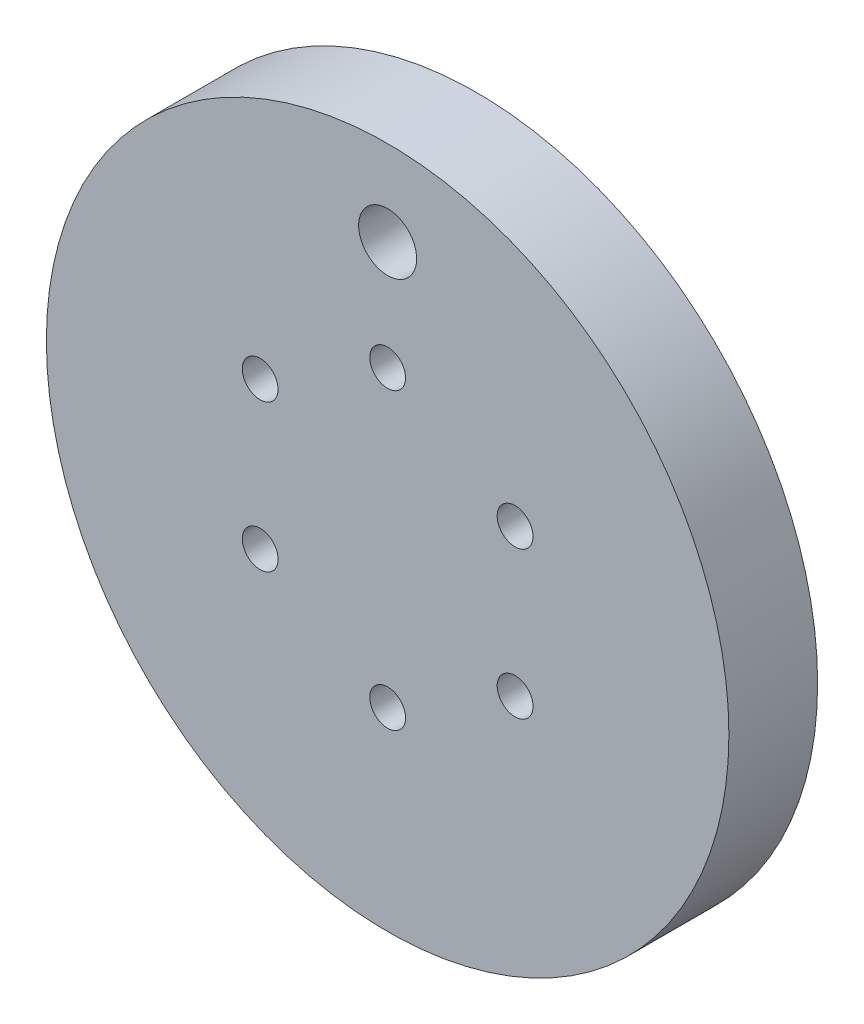
ISO-10303-21;
HEADER;
FILE_DESCRIPTION(('STEP AP214'),'2;1');
FILE_NAME('part.step','',(''),(''),'','','');
FILE_SCHEMA(('AUTOMOTIVE_DESIGN { 1 0 10303 214 1 1 1 1 }'));
ENDSEC;
DATA;
#1=APPLICATION_CONTEXT('core data for automotive mechanical design processes');
#2=APPLICATION_PROTOCOL_DEFINITION('international standard','automotive_design',2000,#1);
#3=PRODUCT_CONTEXT('',#1,'mechanical');
#4=PRODUCT('Part','Part','',(#3));
#5=PRODUCT_RELATED_PRODUCT_CATEGORY('part','',(#4));
#6=PRODUCT_DEFINITION_FORMATION('','',#4);
#7=PRODUCT_DEFINITION_CONTEXT('part definition',#1,'design');
#8=PRODUCT_DEFINITION('design','',#6,#7);
#9=PRODUCT_DEFINITION_SHAPE('','',#8);
#10=(LENGTH_UNIT() NAMED_UNIT(*) SI_UNIT(.MILLI.,.METRE.));
#11=(NAMED_UNIT(*) PLANE_ANGLE_UNIT() SI_UNIT($,.RADIAN.));
#12=(NAMED_UNIT(*) SI_UNIT($,.STERADIAN.) SOLID_ANGLE_UNIT());
#13=UNCERTAINTY_MEASURE_WITH_UNIT(LENGTH_MEASURE(1.E-05),#10,'distance_accuracy_value','');
#14=(GEOMETRIC_REPRESENTATION_CONTEXT(3) GLOBAL_UNCERTAINTY_ASSIGNED_CONTEXT((#13)) GLOBAL_UNIT_ASSIGNED_CONTEXT((#10,
#11,#12)) REPRESENTATION_CONTEXT('',''));
#15=CARTESIAN_POINT('',(0.,0.,0.));
#16=DIRECTION('',(0.,0.,1.));
#17=DIRECTION('',(1.,0.,0.));
#18=AXIS2_PLACEMENT_3D('',#15,#16,#17);
#19=CARTESIAN_POINT('',(0.,0.,10.4));
#20=DIRECTION('',(0.,0.,1.));
#21=DIRECTION('',(1.,0.,0.));
#22=AXIS2_PLACEMENT_3D('',#19,#20,#21);
#23=PLANE('',#22);
#24=CARTESIAN_POINT('',(0.,30.,10.4));
#25=DIRECTION('',(0.,0.,1.));
#26=DIRECTION('',(1.,0.,0.));
#27=AXIS2_PLACEMENT_3D('',#24,#25,#26);
#28=CIRCLE('',#27,3.4);
#29=CARTESIAN_POINT('',(3.4,30.,10.4));
#30=VERTEX_POINT('',#29);
#31=EDGE_CURVE('E145',#30,#30,#28,.T.);
#32=ORIENTED_EDGE('',*,*,#31,.F.);
#33=EDGE_LOOP('',(#32));
#34=FACE_BOUND('',#33,.T.);
#35=CARTESIAN_POINT('',(14.9389382152816,8.62500000000001,10.4));
#36=DIRECTION('',(0.,0.,1.));
#37=DIRECTION('',(1.,0.,0.));
#38=AXIS2_PLACEMENT_3D('',#35,#36,#37);
#39=CIRCLE('',#38,2.1);
#40=CARTESIAN_POINT('',(17.0389382152816,8.62500000000001,10.4));
#41=VERTEX_POINT('',#40);
#42=EDGE_CURVE('E127',#41,#41,#39,.T.);
#43=ORIENTED_EDGE('',*,*,#42,.F.);
#44=EDGE_LOOP('',(#43));
#45=FACE_BOUND('',#44,.T.);
#46=CARTESIAN_POINT('',(0.,-17.25,10.4));
#47=DIRECTION('',(0.,0.,1.));
#48=DIRECTION('',(1.,0.,0.));
#49=AXIS2_PLACEMENT_3D('',#46,#47,#48);
#50=CIRCLE('',#49,2.1);
#51=CARTESIAN_POINT('',(2.1,-17.25,10.4));
#52=VERTEX_POINT('',#51);
#53=EDGE_CURVE('E111',#52,#52,#50,.T.);
#54=ORIENTED_EDGE('',*,*,#53,.F.);
#55=EDGE_LOOP('',(#54));
#56=FACE_BOUND('',#55,.T.);
#57=CARTESIAN_POINT('',(-14.9389382152816,8.62499999999999,10.4));
#58=DIRECTION('',(0.,0.,1.));
#59=DIRECTION('',(1.,0.,0.));
#60=AXIS2_PLACEMENT_3D('',#57,#58,#59);
#61=CIRCLE('',#60,2.1);
#62=CARTESIAN_POINT('',(-12.8389382152816,8.62499999999999,10.4));
#63=VERTEX_POINT('',#62);
#64=EDGE_CURVE('E97',#63,#63,#61,.T.);
#65=ORIENTED_EDGE('',*,*,#64,.F.);
#66=EDGE_LOOP('',(#65));
#67=FACE_BOUND('',#66,.T.);
#68=CARTESIAN_POINT('',(0.,0.,10.4));
#69=DIRECTION('',(0.,0.,1.));
#70=DIRECTION('',(1.,0.,0.));
#71=AXIS2_PLACEMENT_3D('',#68,#69,#70);
#72=CIRCLE('',#71,40.);
#73=CARTESIAN_POINT('',(40.,0.,10.4));
#74=VERTEX_POINT('',#73);
#75=EDGE_CURVE('E11',#74,#74,#72,.T.);
#76=ORIENTED_EDGE('',*,*,#75,.T.);
#77=EDGE_LOOP('',(#76));
#78=FACE_BOUND('',#77,.T.);
#79=CARTESIAN_POINT('',(-14.9389382152816,-8.62500000000001,10.4));
#80=DIRECTION('',(0.,0.,1.));
#81=DIRECTION('',(1.,0.,0.));
#82=AXIS2_PLACEMENT_3D('',#79,#80,#81);
#83=CIRCLE('',#82,2.1);
#84=CARTESIAN_POINT('',(-12.8389382152816,-8.62500000000001,10.4));
#85=VERTEX_POINT('',#84);
#86=EDGE_CURVE('E103',#85,#85,#83,.T.);
#87=ORIENTED_EDGE('',*,*,#86,.F.);
#88=EDGE_LOOP('',(#87));
#89=FACE_BOUND('',#88,.T.);
#90=CARTESIAN_POINT('',(14.9389382152816,-8.625,10.4));
#91=DIRECTION('',(0.,0.,1.));
#92=DIRECTION('',(1.,0.,0.));
#93=AXIS2_PLACEMENT_3D('',#90,#91,#92);
#94=CIRCLE('',#93,2.1);
#95=CARTESIAN_POINT('',(17.0389382152816,-8.625,10.4));
#96=VERTEX_POINT('',#95);
#97=EDGE_CURVE('E119',#96,#96,#94,.T.);
#98=ORIENTED_EDGE('',*,*,#97,.F.);
#99=EDGE_LOOP('',(#98));
#100=FACE_BOUND('',#99,.T.);
#101=CARTESIAN_POINT('',(0.,17.25,10.4));
#102=DIRECTION('',(0.,0.,1.));
#103=DIRECTION('',(1.,0.,0.));
#104=AXIS2_PLACEMENT_3D('',#101,#102,#103);
#105=CIRCLE('',#104,2.1);
#106=CARTESIAN_POINT('',(2.1,17.25,10.4));
#107=VERTEX_POINT('',#106);
#108=EDGE_CURVE('E134',#107,#107,#105,.T.);
#109=ORIENTED_EDGE('',*,*,#108,.F.);
#110=EDGE_LOOP('',(#109));
#111=FACE_BOUND('',#110,.T.);
#112=ADVANCED_FACE('F81',(#34,#45,#56,#67,#78,#89,#100,#111),#23,.T.);
#113=CARTESIAN_POINT('',(0.,0.,0.));
#114=DIRECTION('',(0.,0.,1.));
#115=DIRECTION('',(1.,0.,0.));
#116=AXIS2_PLACEMENT_3D('',#113,#114,#115);
#117=PLANE('',#116);
#118=CARTESIAN_POINT('',(0.,30.,0.));
#119=DIRECTION('',(0.,0.,1.));
#120=DIRECTION('',(1.,0.,0.));
#121=AXIS2_PLACEMENT_3D('',#118,#119,#120);
#122=CIRCLE('',#121,3.4);
#123=CARTESIAN_POINT('',(3.4,30.,0.));
#124=VERTEX_POINT('',#123);
#125=EDGE_CURVE('E141',#124,#124,#122,.T.);
#126=ORIENTED_EDGE('',*,*,#125,.T.);
#127=EDGE_LOOP('',(#126));
#128=FACE_BOUND('',#127,.T.);
#129=CARTESIAN_POINT('',(0.,0.,0.));
#130=DIRECTION('',(0.,0.,1.));
#131=DIRECTION('',(1.,0.,0.));
#132=AXIS2_PLACEMENT_3D('',#129,#130,#131);
#133=CIRCLE('',#132,40.);
#134=CARTESIAN_POINT('',(40.,0.,0.));
#135=VERTEX_POINT('',#134);
#136=EDGE_CURVE('E85',#135,#135,#133,.T.);
#137=ORIENTED_EDGE('',*,*,#136,.F.);
#138=EDGE_LOOP('',(#137));
#139=FACE_BOUND('',#138,.T.);
#140=CARTESIAN_POINT('',(-14.9389382152816,8.62499999999999,0.));
#141=DIRECTION('',(0.,0.,1.));
#142=DIRECTION('',(1.,0.,0.));
#143=AXIS2_PLACEMENT_3D('',#140,#141,#142);
#144=CIRCLE('',#143,2.1);
#145=CARTESIAN_POINT('',(-12.8389382152816,8.62499999999999,0.));
#146=VERTEX_POINT('',#145);
#147=EDGE_CURVE('E99',#146,#146,#144,.T.);
#148=ORIENTED_EDGE('',*,*,#147,.T.);
#149=EDGE_LOOP('',(#148));
#150=FACE_BOUND('',#149,.T.);
#151=CARTESIAN_POINT('',(-14.9389382152816,-8.62500000000001,0.));
#152=DIRECTION('',(0.,0.,1.));
#153=DIRECTION('',(1.,0.,0.));
#154=AXIS2_PLACEMENT_3D('',#151,#152,#153);
#155=CIRCLE('',#154,2.1);
#156=CARTESIAN_POINT('',(-12.8389382152816,-8.62500000000001,0.));
#157=VERTEX_POINT('',#156);
#158=EDGE_CURVE('E107',#157,#157,#155,.T.);
#159=ORIENTED_EDGE('',*,*,#158,.T.);
#160=EDGE_LOOP('',(#159));
#161=FACE_BOUND('',#160,.T.);
#162=CARTESIAN_POINT('',(0.,-17.25,0.));
#163=DIRECTION('',(0.,0.,1.));
#164=DIRECTION('',(1.,0.,0.));
#165=AXIS2_PLACEMENT_3D('',#162,#163,#164);
#166=CIRCLE('',#165,2.1);
#167=CARTESIAN_POINT('',(2.1,-17.25,0.));
#168=VERTEX_POINT('',#167);
#169=EDGE_CURVE('E115',#168,#168,#166,.T.);
#170=ORIENTED_EDGE('',*,*,#169,.T.);
#171=EDGE_LOOP('',(#170));
#172=FACE_BOUND('',#171,.T.);
#173=CARTESIAN_POINT('',(14.9389382152816,-8.625,0.));
#174=DIRECTION('',(0.,0.,1.));
#175=DIRECTION('',(1.,0.,0.));
#176=AXIS2_PLACEMENT_3D('',#173,#174,#175);
#177=CIRCLE('',#176,2.1);
#178=CARTESIAN_POINT('',(17.0389382152816,-8.625,0.));
#179=VERTEX_POINT('',#178);
#180=EDGE_CURVE('E123',#179,#179,#177,.T.);
#181=ORIENTED_EDGE('',*,*,#180,.T.);
#182=EDGE_LOOP('',(#181));
#183=FACE_BOUND('',#182,.T.);
#184=CARTESIAN_POINT('',(14.9389382152816,8.62500000000001,0.));
#185=DIRECTION('',(0.,0.,1.));
#186=DIRECTION('',(1.,0.,0.));
#187=AXIS2_PLACEMENT_3D('',#184,#185,#186);
#188=CIRCLE('',#187,2.1);
#189=CARTESIAN_POINT('',(17.0389382152816,8.62500000000001,0.));
#190=VERTEX_POINT('',#189);
#191=EDGE_CURVE('E130',#190,#190,#188,.T.);
#192=ORIENTED_EDGE('',*,*,#191,.T.);
#193=EDGE_LOOP('',(#192));
#194=FACE_BOUND('',#193,.T.);
#195=CARTESIAN_POINT('',(0.,17.25,0.));
#196=DIRECTION('',(0.,0.,1.));
#197=DIRECTION('',(1.,0.,0.));
#198=AXIS2_PLACEMENT_3D('',#195,#196,#197);
#199=CIRCLE('',#198,2.1);
#200=CARTESIAN_POINT('',(2.1,17.25,0.));
#201=VERTEX_POINT('',#200);
#202=EDGE_CURVE('E138',#201,#201,#199,.T.);
#203=ORIENTED_EDGE('',*,*,#202,.T.);
#204=EDGE_LOOP('',(#203));
#205=FACE_BOUND('',#204,.T.);
#206=ADVANCED_FACE('F154',(#128,#139,#150,#161,#172,#183,#194,#205),#117,.F.);
#207=CARTESIAN_POINT('',(0.,0.,10.4));
#208=DIRECTION('',(0.,0.,-1.));
#209=DIRECTION('',(-1.,0.,0.));
#210=AXIS2_PLACEMENT_3D('',#207,#208,#209);
#211=CYLINDRICAL_SURFACE('',#210,40.);
#212=ORIENTED_EDGE('',*,*,#75,.F.);
#213=EDGE_LOOP('',(#212));
#214=FACE_BOUND('',#213,.T.);
#215=ORIENTED_EDGE('',*,*,#136,.T.);
#216=EDGE_LOOP('',(#215));
#217=FACE_BOUND('',#216,.T.);
#218=ADVANCED_FACE('F83',(#214,#217),#211,.T.);
#219=CARTESIAN_POINT('',(-14.9389382152816,8.62499999999999,10.4));
#220=DIRECTION('',(0.,0.,-1.));
#221=DIRECTION('',(-1.,0.,0.));
#222=AXIS2_PLACEMENT_3D('',#219,#220,#221);
#223=CYLINDRICAL_SURFACE('',#222,2.1);
#224=ORIENTED_EDGE('',*,*,#64,.T.);
#225=EDGE_LOOP('',(#224));
#226=FACE_BOUND('',#225,.T.);
#227=ORIENTED_EDGE('',*,*,#147,.F.);
#228=EDGE_LOOP('',(#227));
#229=FACE_BOUND('',#228,.T.);
#230=ADVANCED_FACE('F189',(#226,#229),#223,.F.);
#231=CARTESIAN_POINT('',(-14.9389382152816,-8.62500000000001,10.4));
#232=DIRECTION('',(0.,0.,-1.));
#233=DIRECTION('',(-1.,0.,0.));
#234=AXIS2_PLACEMENT_3D('',#231,#232,#233);
#235=CYLINDRICAL_SURFACE('',#234,2.1);
#236=ORIENTED_EDGE('',*,*,#86,.T.);
#237=EDGE_LOOP('',(#236));
#238=FACE_BOUND('',#237,.T.);
#239=ORIENTED_EDGE('',*,*,#158,.F.);
#240=EDGE_LOOP('',(#239));
#241=FACE_BOUND('',#240,.T.);
#242=ADVANCED_FACE('F194',(#238,#241),#235,.F.);
#243=CARTESIAN_POINT('',(0.,-17.25,10.4));
#244=DIRECTION('',(0.,0.,-1.));
#245=DIRECTION('',(-1.,0.,0.));
#246=AXIS2_PLACEMENT_3D('',#243,#244,#245);
#247=CYLINDRICAL_SURFACE('',#246,2.1);
#248=ORIENTED_EDGE('',*,*,#53,.T.);
#249=EDGE_LOOP('',(#248));
#250=FACE_BOUND('',#249,.T.);
#251=ORIENTED_EDGE('',*,*,#169,.F.);
#252=EDGE_LOOP('',(#251));
#253=FACE_BOUND('',#252,.T.);
#254=ADVANCED_FACE('F198',(#250,#253),#247,.F.);
#255=CARTESIAN_POINT('',(14.9389382152816,-8.625,10.4));
#256=DIRECTION('',(0.,0.,-1.));
#257=DIRECTION('',(-1.,0.,0.));
#258=AXIS2_PLACEMENT_3D('',#255,#256,#257);
#259=CYLINDRICAL_SURFACE('',#258,2.1);
#260=ORIENTED_EDGE('',*,*,#97,.T.);
#261=EDGE_LOOP('',(#260));
#262=FACE_BOUND('',#261,.T.);
#263=ORIENTED_EDGE('',*,*,#180,.F.);
#264=EDGE_LOOP('',(#263));
#265=FACE_BOUND('',#264,.T.);
#266=ADVANCED_FACE('F202',(#262,#265),#259,.F.);
#267=CARTESIAN_POINT('',(14.9389382152816,8.62500000000001,10.4));
#268=DIRECTION('',(0.,0.,-1.));
#269=DIRECTION('',(-1.,0.,0.));
#270=AXIS2_PLACEMENT_3D('',#267,#268,#269);
#271=CYLINDRICAL_SURFACE('',#270,2.1);
#272=ORIENTED_EDGE('',*,*,#42,.T.);
#273=EDGE_LOOP('',(#272));
#274=FACE_BOUND('',#273,.T.);
#275=ORIENTED_EDGE('',*,*,#191,.F.);
#276=EDGE_LOOP('',(#275));
#277=FACE_BOUND('',#276,.T.);
#278=ADVANCED_FACE('F181',(#274,#277),#271,.F.);
#279=CARTESIAN_POINT('',(0.,17.25,10.4));
#280=DIRECTION('',(0.,0.,-1.));
#281=DIRECTION('',(-1.,0.,0.));
#282=AXIS2_PLACEMENT_3D('',#279,#280,#281);
#283=CYLINDRICAL_SURFACE('',#282,2.1);
#284=ORIENTED_EDGE('',*,*,#108,.T.);
#285=EDGE_LOOP('',(#284));
#286=FACE_BOUND('',#285,.T.);
#287=ORIENTED_EDGE('',*,*,#202,.F.);
#288=EDGE_LOOP('',(#287));
#289=FACE_BOUND('',#288,.T.);
#290=ADVANCED_FACE('F160',(#286,#289),#283,.F.);
#291=CARTESIAN_POINT('',(0.,30.,0.));
#292=DIRECTION('',(0.,0.,1.));
#293=DIRECTION('',(1.,0.,0.));
#294=AXIS2_PLACEMENT_3D('',#291,#292,#293);
#295=CYLINDRICAL_SURFACE('',#294,3.4);
#296=ORIENTED_EDGE('',*,*,#125,.F.);
#297=EDGE_LOOP('',(#296));
#298=FACE_BOUND('',#297,.T.);
#299=ORIENTED_EDGE('',*,*,#31,.T.);
#300=EDGE_LOOP('',(#299));
#301=FACE_BOUND('',#300,.T.);
#302=ADVANCED_FACE('F157',(#298,#301),#295,.F.);
#303=CLOSED_SHELL('',(#112,#206,#218,#230,#242,#254,#266,#278,#290,#302));
#304=MANIFOLD_SOLID_BREP('B2',#303);
#305=ADVANCED_BREP_SHAPE_REPRESENTATION('',(#18,#304),#14);
#306=SHAPE_DEFINITION_REPRESENTATION(#9,#305);
ENDSEC;
END-ISO-10303-21;
